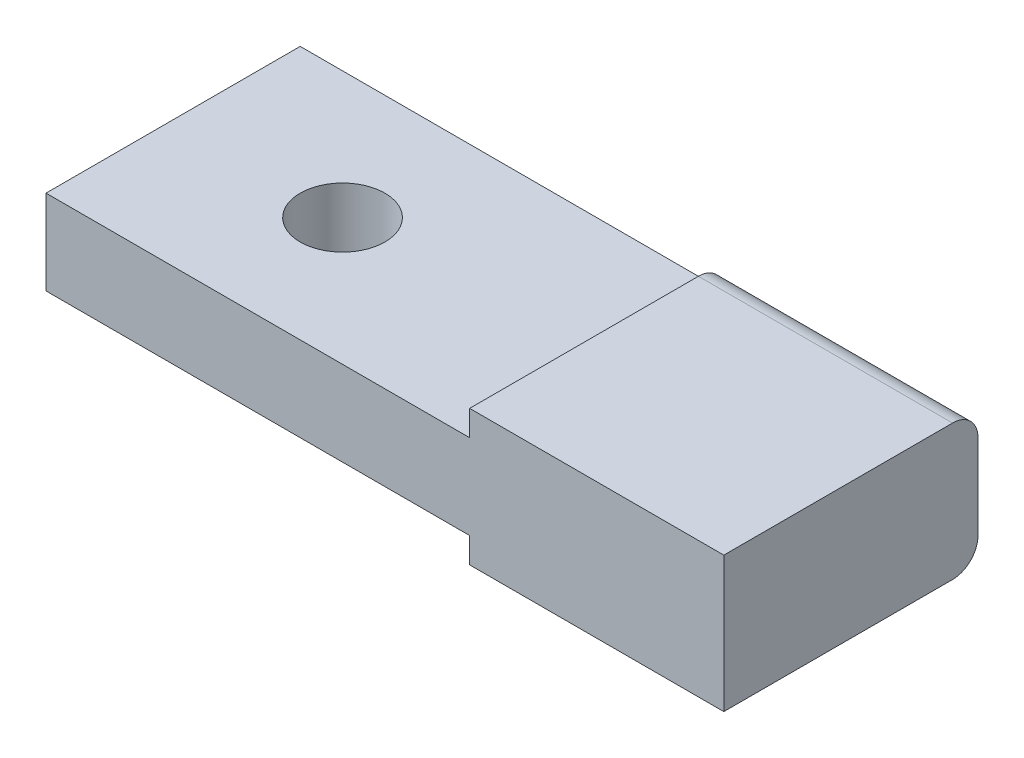
ISO-10303-21;
HEADER;
FILE_DESCRIPTION(('STEP AP214'),'2;1');
FILE_NAME('part.step','',(''),(''),'','','');
FILE_SCHEMA(('AUTOMOTIVE_DESIGN { 1 0 10303 214 1 1 1 1 }'));
ENDSEC;
DATA;
#1=APPLICATION_CONTEXT('core data for automotive mechanical design processes');
#2=APPLICATION_PROTOCOL_DEFINITION('international standard','automotive_design',2000,#1);
#3=PRODUCT_CONTEXT('',#1,'mechanical');
#4=PRODUCT('Part','Part','',(#3));
#5=PRODUCT_RELATED_PRODUCT_CATEGORY('part','',(#4));
#6=PRODUCT_DEFINITION_FORMATION('','',#4);
#7=PRODUCT_DEFINITION_CONTEXT('part definition',#1,'design');
#8=PRODUCT_DEFINITION('design','',#6,#7);
#9=PRODUCT_DEFINITION_SHAPE('','',#8);
#10=(LENGTH_UNIT() NAMED_UNIT(*) SI_UNIT(.MILLI.,.METRE.));
#11=(NAMED_UNIT(*) PLANE_ANGLE_UNIT() SI_UNIT($,.RADIAN.));
#12=(NAMED_UNIT(*) SI_UNIT($,.STERADIAN.) SOLID_ANGLE_UNIT());
#13=UNCERTAINTY_MEASURE_WITH_UNIT(LENGTH_MEASURE(1.E-05),#10,'distance_accuracy_value','');
#14=(GEOMETRIC_REPRESENTATION_CONTEXT(3) GLOBAL_UNCERTAINTY_ASSIGNED_CONTEXT((#13)) GLOBAL_UNIT_ASSIGNED_CONTEXT((#10,
#11,#12)) REPRESENTATION_CONTEXT('',''));
#15=CARTESIAN_POINT('',(0.,0.,0.));
#16=DIRECTION('',(0.,0.,1.));
#17=DIRECTION('',(1.,0.,0.));
#18=AXIS2_PLACEMENT_3D('',#15,#16,#17);
#19=CARTESIAN_POINT('',(0.,0.,15.));
#20=DIRECTION('',(1.,0.,0.));
#21=DIRECTION('',(0.,1.,0.));
#22=AXIS2_PLACEMENT_3D('',#19,#20,#21);
#23=PLANE('',#22);
#24=DIRECTION('',(0.,-1.,0.));
#25=VECTOR('',#24,1.);
#26=CARTESIAN_POINT('',(0.,0.,0.));
#27=LINE('',#26,#25);
#28=CARTESIAN_POINT('',(0.,6.5,0.));
#29=VERTEX_POINT('',#28);
#30=CARTESIAN_POINT('',(0.,1.5,0.));
#31=VERTEX_POINT('',#30);
#32=EDGE_CURVE('E144',#29,#31,#27,.T.);
#33=ORIENTED_EDGE('',*,*,#32,.T.);
#34=DIRECTION('',(0.,0.,1.));
#35=VECTOR('',#34,1.);
#36=CARTESIAN_POINT('',(0.,1.5,15.));
#37=LINE('',#36,#35);
#38=CARTESIAN_POINT('',(0.,1.5,15.));
#39=VERTEX_POINT('',#38);
#40=EDGE_CURVE('E129',#31,#39,#37,.T.);
#41=ORIENTED_EDGE('',*,*,#40,.T.);
#42=DIRECTION('',(0.,-1.,0.));
#43=VECTOR('',#42,1.);
#44=CARTESIAN_POINT('',(0.,0.,15.));
#45=LINE('',#44,#43);
#46=CARTESIAN_POINT('',(0.,6.5,15.));
#47=VERTEX_POINT('',#46);
#48=EDGE_CURVE('E124',#47,#39,#45,.T.);
#49=ORIENTED_EDGE('',*,*,#48,.F.);
#50=DIRECTION('',(0.,0.,-1.));
#51=VECTOR('',#50,1.);
#52=CARTESIAN_POINT('',(0.,6.5,15.));
#53=LINE('',#52,#51);
#54=EDGE_CURVE('E139',#47,#29,#53,.T.);
#55=ORIENTED_EDGE('',*,*,#54,.T.);
#56=EDGE_LOOP('',(#33,#41,#49,#55));
#57=FACE_BOUND('',#56,.T.);
#58=ADVANCED_FACE('F33',(#57),#23,.F.);
#59=CARTESIAN_POINT('',(0.,0.,15.));
#60=DIRECTION('',(0.,1.,0.));
#61=DIRECTION('',(0.,0.,1.));
#62=AXIS2_PLACEMENT_3D('',#59,#60,#61);
#63=PLANE('',#62);
#64=DIRECTION('',(0.,0.,-1.));
#65=VECTOR('',#64,1.);
#66=CARTESIAN_POINT('',(25.,0.,15.));
#67=LINE('',#66,#65);
#68=CARTESIAN_POINT('',(25.,0.,15.));
#69=VERTEX_POINT('',#68);
#70=CARTESIAN_POINT('',(25.,0.,1.5));
#71=VERTEX_POINT('',#70);
#72=EDGE_CURVE('E106',#69,#71,#67,.T.);
#73=ORIENTED_EDGE('',*,*,#72,.T.);
#74=DIRECTION('',(1.,0.,0.));
#75=VECTOR('',#74,1.);
#76=CARTESIAN_POINT('',(40.,0.,1.5));
#77=LINE('',#76,#75);
#78=CARTESIAN_POINT('',(40.,0.,1.5));
#79=VERTEX_POINT('',#78);
#80=EDGE_CURVE('E41',#71,#79,#77,.T.);
#81=ORIENTED_EDGE('',*,*,#80,.T.);
#82=DIRECTION('',(0.,0.,-1.));
#83=VECTOR('',#82,1.);
#84=CARTESIAN_POINT('',(40.,0.,15.));
#85=LINE('',#84,#83);
#86=CARTESIAN_POINT('',(40.,0.,15.));
#87=VERTEX_POINT('',#86);
#88=EDGE_CURVE('E161',#87,#79,#85,.T.);
#89=ORIENTED_EDGE('',*,*,#88,.F.);
#90=DIRECTION('',(1.,0.,0.));
#91=VECTOR('',#90,1.);
#92=CARTESIAN_POINT('',(0.,0.,15.));
#93=LINE('',#92,#91);
#94=EDGE_CURVE('E146',#69,#87,#93,.T.);
#95=ORIENTED_EDGE('',*,*,#94,.F.);
#96=EDGE_LOOP('',(#73,#81,#89,#95));
#97=FACE_BOUND('',#96,.T.);
#98=ADVANCED_FACE('F182',(#97),#63,.F.);
#99=CARTESIAN_POINT('',(40.,0.,15.));
#100=DIRECTION('',(-1.,0.,0.));
#101=DIRECTION('',(0.,0.,1.));
#102=AXIS2_PLACEMENT_3D('',#99,#100,#101);
#103=PLANE('',#102);
#104=DIRECTION('',(0.,1.,0.));
#105=VECTOR('',#104,1.);
#106=CARTESIAN_POINT('',(40.,0.,0.));
#107=LINE('',#106,#105);
#108=CARTESIAN_POINT('',(40.,1.5,0.));
#109=VERTEX_POINT('',#108);
#110=CARTESIAN_POINT('',(40.,6.5,0.));
#111=VERTEX_POINT('',#110);
#112=EDGE_CURVE('E147',#109,#111,#107,.T.);
#113=ORIENTED_EDGE('',*,*,#112,.T.);
#114=CARTESIAN_POINT('',(40.,6.5,1.5));
#115=DIRECTION('',(-1.,0.,0.));
#116=DIRECTION('',(0.,0.,1.));
#117=AXIS2_PLACEMENT_3D('',#114,#115,#116);
#118=CIRCLE('',#117,1.5);
#119=CARTESIAN_POINT('',(40.,8.,1.5));
#120=VERTEX_POINT('',#119);
#121=EDGE_CURVE('E179',#111,#120,#118,.F.);
#122=ORIENTED_EDGE('',*,*,#121,.T.);
#123=DIRECTION('',(0.,0.,-1.));
#124=VECTOR('',#123,1.);
#125=CARTESIAN_POINT('',(40.,8.,15.));
#126=LINE('',#125,#124);
#127=CARTESIAN_POINT('',(40.,8.,15.));
#128=VERTEX_POINT('',#127);
#129=EDGE_CURVE('E154',#128,#120,#126,.T.);
#130=ORIENTED_EDGE('',*,*,#129,.F.);
#131=DIRECTION('',(0.,1.,0.));
#132=VECTOR('',#131,1.);
#133=CARTESIAN_POINT('',(40.,0.,15.));
#134=LINE('',#133,#132);
#135=EDGE_CURVE('E149',#87,#128,#134,.T.);
#136=ORIENTED_EDGE('',*,*,#135,.F.);
#137=ORIENTED_EDGE('',*,*,#88,.T.);
#138=CARTESIAN_POINT('',(40.,1.5,1.5));
#139=DIRECTION('',(-1.,0.,0.));
#140=DIRECTION('',(0.,0.,1.));
#141=AXIS2_PLACEMENT_3D('',#138,#139,#140);
#142=CIRCLE('',#141,1.5);
#143=EDGE_CURVE('E54',#79,#109,#142,.F.);
#144=ORIENTED_EDGE('',*,*,#143,.T.);
#145=EDGE_LOOP('',(#113,#122,#130,#136,#137,#144));
#146=FACE_BOUND('',#145,.T.);
#147=ADVANCED_FACE('F185',(#146),#103,.F.);
#148=CARTESIAN_POINT('',(0.,8.,15.));
#149=DIRECTION('',(0.,-1.,0.));
#150=DIRECTION('',(0.,0.,-1.));
#151=AXIS2_PLACEMENT_3D('',#148,#149,#150);
#152=PLANE('',#151);
#153=ORIENTED_EDGE('',*,*,#129,.T.);
#154=DIRECTION('',(-1.,0.,0.));
#155=VECTOR('',#154,1.);
#156=CARTESIAN_POINT('',(25.,8.,1.5));
#157=LINE('',#156,#155);
#158=CARTESIAN_POINT('',(25.,8.,1.5));
#159=VERTEX_POINT('',#158);
#160=EDGE_CURVE('E166',#120,#159,#157,.T.);
#161=ORIENTED_EDGE('',*,*,#160,.T.);
#162=DIRECTION('',(0.,0.,1.));
#163=VECTOR('',#162,1.);
#164=CARTESIAN_POINT('',(25.,8.,15.));
#165=LINE('',#164,#163);
#166=CARTESIAN_POINT('',(25.,8.,15.));
#167=VERTEX_POINT('',#166);
#168=EDGE_CURVE('E142',#159,#167,#165,.T.);
#169=ORIENTED_EDGE('',*,*,#168,.T.);
#170=DIRECTION('',(-1.,0.,0.));
#171=VECTOR('',#170,1.);
#172=CARTESIAN_POINT('',(0.,8.,15.));
#173=LINE('',#172,#171);
#174=EDGE_CURVE('E151',#128,#167,#173,.T.);
#175=ORIENTED_EDGE('',*,*,#174,.F.);
#176=EDGE_LOOP('',(#153,#161,#169,#175));
#177=FACE_BOUND('',#176,.T.);
#178=ADVANCED_FACE('F191',(#177),#152,.F.);
#179=CARTESIAN_POINT('',(0.,0.,15.));
#180=DIRECTION('',(0.,0.,-1.));
#181=DIRECTION('',(-1.,0.,0.));
#182=AXIS2_PLACEMENT_3D('',#179,#180,#181);
#183=PLANE('',#182);
#184=ORIENTED_EDGE('',*,*,#48,.T.);
#185=DIRECTION('',(-1.,0.,0.));
#186=VECTOR('',#185,1.);
#187=CARTESIAN_POINT('',(-5.58948834541805,1.5,15.));
#188=LINE('',#187,#186);
#189=CARTESIAN_POINT('',(25.,1.5,15.));
#190=VERTEX_POINT('',#189);
#191=EDGE_CURVE('E110',#190,#39,#188,.T.);
#192=ORIENTED_EDGE('',*,*,#191,.F.);
#193=DIRECTION('',(0.,1.,0.));
#194=VECTOR('',#193,1.);
#195=CARTESIAN_POINT('',(25.,1.5,15.));
#196=LINE('',#195,#194);
#197=EDGE_CURVE('E102',#69,#190,#196,.T.);
#198=ORIENTED_EDGE('',*,*,#197,.F.);
#199=ORIENTED_EDGE('',*,*,#94,.T.);
#200=ORIENTED_EDGE('',*,*,#135,.T.);
#201=ORIENTED_EDGE('',*,*,#174,.T.);
#202=DIRECTION('',(0.,1.,0.));
#203=VECTOR('',#202,1.);
#204=CARTESIAN_POINT('',(25.,18.4171601715838,15.));
#205=LINE('',#204,#203);
#206=CARTESIAN_POINT('',(25.,6.5,15.));
#207=VERTEX_POINT('',#206);
#208=EDGE_CURVE('E133',#207,#167,#205,.T.);
#209=ORIENTED_EDGE('',*,*,#208,.F.);
#210=DIRECTION('',(1.,0.,0.));
#211=VECTOR('',#210,1.);
#212=CARTESIAN_POINT('',(-4.03459798568562,6.5,15.));
#213=LINE('',#212,#211);
#214=EDGE_CURVE('E131',#47,#207,#213,.T.);
#215=ORIENTED_EDGE('',*,*,#214,.F.);
#216=EDGE_LOOP('',(#184,#192,#198,#199,#200,#201,#209,#215));
#217=FACE_BOUND('',#216,.T.);
#218=ADVANCED_FACE('F121',(#217),#183,.F.);
#219=CARTESIAN_POINT('',(0.,0.,0.));
#220=DIRECTION('',(0.,0.,-1.));
#221=DIRECTION('',(-1.,0.,0.));
#222=AXIS2_PLACEMENT_3D('',#219,#220,#221);
#223=PLANE('',#222);
#224=DIRECTION('',(-1.,0.,0.));
#225=VECTOR('',#224,1.);
#226=CARTESIAN_POINT('',(0.,6.5,0.));
#227=LINE('',#226,#225);
#228=CARTESIAN_POINT('',(25.,6.5,0.));
#229=VERTEX_POINT('',#228);
#230=EDGE_CURVE('E164',#229,#29,#227,.T.);
#231=ORIENTED_EDGE('',*,*,#230,.F.);
#232=DIRECTION('',(-1.,0.,0.));
#233=VECTOR('',#232,1.);
#234=CARTESIAN_POINT('',(40.,6.5,0.));
#235=LINE('',#234,#233);
#236=EDGE_CURVE('E176',#229,#111,#235,.F.);
#237=ORIENTED_EDGE('',*,*,#236,.T.);
#238=ORIENTED_EDGE('',*,*,#112,.F.);
#239=DIRECTION('',(1.,0.,0.));
#240=VECTOR('',#239,1.);
#241=CARTESIAN_POINT('',(25.,1.5,0.));
#242=LINE('',#241,#240);
#243=CARTESIAN_POINT('',(25.,1.5,0.));
#244=VERTEX_POINT('',#243);
#245=EDGE_CURVE('E174',#109,#244,#242,.F.);
#246=ORIENTED_EDGE('',*,*,#245,.T.);
#247=DIRECTION('',(-1.,0.,0.));
#248=VECTOR('',#247,1.);
#249=CARTESIAN_POINT('',(-5.58948834541805,1.5,0.));
#250=LINE('',#249,#248);
#251=EDGE_CURVE('E118',#244,#31,#250,.T.);
#252=ORIENTED_EDGE('',*,*,#251,.T.);
#253=ORIENTED_EDGE('',*,*,#32,.F.);
#254=EDGE_LOOP('',(#231,#237,#238,#246,#252,#253));
#255=FACE_BOUND('',#254,.T.);
#256=ADVANCED_FACE('F203',(#255),#223,.T.);
#257=CARTESIAN_POINT('',(25.,18.4171601715838,0.));
#258=DIRECTION('',(1.,0.,0.));
#259=DIRECTION('',(0.,0.,-1.));
#260=AXIS2_PLACEMENT_3D('',#257,#258,#259);
#261=PLANE('',#260);
#262=ORIENTED_EDGE('',*,*,#168,.F.);
#263=CARTESIAN_POINT('',(25.,6.5,1.5));
#264=DIRECTION('',(1.,0.,0.));
#265=DIRECTION('',(0.,0.,-1.));
#266=AXIS2_PLACEMENT_3D('',#263,#264,#265);
#267=CIRCLE('',#266,1.5);
#268=EDGE_CURVE('E172',#159,#229,#267,.F.);
#269=ORIENTED_EDGE('',*,*,#268,.T.);
#270=DIRECTION('',(0.,0.,1.));
#271=VECTOR('',#270,1.);
#272=CARTESIAN_POINT('',(25.,6.5,0.));
#273=LINE('',#272,#271);
#274=EDGE_CURVE('E136',#229,#207,#273,.T.);
#275=ORIENTED_EDGE('',*,*,#274,.T.);
#276=ORIENTED_EDGE('',*,*,#208,.T.);
#277=EDGE_LOOP('',(#262,#269,#275,#276));
#278=FACE_BOUND('',#277,.T.);
#279=ADVANCED_FACE('F195',(#278),#261,.F.);
#280=CARTESIAN_POINT('',(-4.03459798568562,6.5,0.));
#281=DIRECTION('',(0.,-1.,0.));
#282=DIRECTION('',(0.,0.,-1.));
#283=AXIS2_PLACEMENT_3D('',#280,#281,#282);
#284=PLANE('',#283);
#285=CARTESIAN_POINT('',(10.,6.5,7.5));
#286=DIRECTION('',(0.,1.,0.));
#287=DIRECTION('',(0.,0.,1.));
#288=AXIS2_PLACEMENT_3D('',#285,#286,#287);
#289=CIRCLE('',#288,2.5);
#290=CARTESIAN_POINT('',(10.,6.5,10.));
#291=VERTEX_POINT('',#290);
#292=EDGE_CURVE('E169',#291,#291,#289,.T.);
#293=ORIENTED_EDGE('',*,*,#292,.F.);
#294=EDGE_LOOP('',(#293));
#295=FACE_BOUND('',#294,.T.);
#296=ORIENTED_EDGE('',*,*,#214,.T.);
#297=ORIENTED_EDGE('',*,*,#274,.F.);
#298=ORIENTED_EDGE('',*,*,#230,.T.);
#299=ORIENTED_EDGE('',*,*,#54,.F.);
#300=EDGE_LOOP('',(#296,#297,#298,#299));
#301=FACE_BOUND('',#300,.T.);
#302=ADVANCED_FACE('F199',(#295,#301),#284,.F.);
#303=CARTESIAN_POINT('',(-5.58948834541805,1.5,0.));
#304=DIRECTION('',(0.,1.,0.));
#305=DIRECTION('',(0.,0.,1.));
#306=AXIS2_PLACEMENT_3D('',#303,#304,#305);
#307=PLANE('',#306);
#308=CARTESIAN_POINT('',(10.,1.5,7.5));
#309=DIRECTION('',(0.,1.,0.));
#310=DIRECTION('',(0.,0.,1.));
#311=AXIS2_PLACEMENT_3D('',#308,#309,#310);
#312=CIRCLE('',#311,2.5);
#313=CARTESIAN_POINT('',(10.,1.5,10.));
#314=VERTEX_POINT('',#313);
#315=EDGE_CURVE('E111',#314,#314,#312,.T.);
#316=ORIENTED_EDGE('',*,*,#315,.T.);
#317=EDGE_LOOP('',(#316));
#318=FACE_BOUND('',#317,.T.);
#319=ORIENTED_EDGE('',*,*,#251,.F.);
#320=DIRECTION('',(0.,0.,1.));
#321=VECTOR('',#320,1.);
#322=CARTESIAN_POINT('',(25.,1.5,0.));
#323=LINE('',#322,#321);
#324=EDGE_CURVE('E105',#244,#190,#323,.T.);
#325=ORIENTED_EDGE('',*,*,#324,.T.);
#326=ORIENTED_EDGE('',*,*,#191,.T.);
#327=ORIENTED_EDGE('',*,*,#40,.F.);
#328=EDGE_LOOP('',(#319,#325,#326,#327));
#329=FACE_BOUND('',#328,.T.);
#330=ADVANCED_FACE('F115',(#318,#329),#307,.F.);
#331=CARTESIAN_POINT('',(25.,1.5,0.));
#332=DIRECTION('',(1.,0.,0.));
#333=DIRECTION('',(0.,0.,-1.));
#334=AXIS2_PLACEMENT_3D('',#331,#332,#333);
#335=PLANE('',#334);
#336=ORIENTED_EDGE('',*,*,#324,.F.);
#337=CARTESIAN_POINT('',(25.,1.5,1.5));
#338=DIRECTION('',(1.,0.,0.));
#339=DIRECTION('',(0.,0.,-1.));
#340=AXIS2_PLACEMENT_3D('',#337,#338,#339);
#341=CIRCLE('',#340,1.5);
#342=EDGE_CURVE('E11',#244,#71,#341,.F.);
#343=ORIENTED_EDGE('',*,*,#342,.T.);
#344=ORIENTED_EDGE('',*,*,#72,.F.);
#345=ORIENTED_EDGE('',*,*,#197,.T.);
#346=EDGE_LOOP('',(#336,#343,#344,#345));
#347=FACE_BOUND('',#346,.T.);
#348=ADVANCED_FACE('F104',(#347),#335,.F.);
#349=CARTESIAN_POINT('',(10.,-8.5,7.5));
#350=DIRECTION('',(0.,1.,0.));
#351=DIRECTION('',(0.,0.,1.));
#352=AXIS2_PLACEMENT_3D('',#349,#350,#351);
#353=CYLINDRICAL_SURFACE('',#352,2.5);
#354=ORIENTED_EDGE('',*,*,#292,.T.);
#355=EDGE_LOOP('',(#354));
#356=FACE_BOUND('',#355,.T.);
#357=ORIENTED_EDGE('',*,*,#315,.F.);
#358=EDGE_LOOP('',(#357));
#359=FACE_BOUND('',#358,.T.);
#360=ADVANCED_FACE('F211',(#356,#359),#353,.F.);
#361=CARTESIAN_POINT('',(0.,6.5,1.5));
#362=DIRECTION('',(1.,0.,0.));
#363=DIRECTION('',(0.,0.,-1.));
#364=AXIS2_PLACEMENT_3D('',#361,#362,#363);
#365=CYLINDRICAL_SURFACE('',#364,1.5);
#366=ORIENTED_EDGE('',*,*,#121,.F.);
#367=ORIENTED_EDGE('',*,*,#236,.F.);
#368=ORIENTED_EDGE('',*,*,#268,.F.);
#369=ORIENTED_EDGE('',*,*,#160,.F.);
#370=EDGE_LOOP('',(#366,#367,#368,#369));
#371=FACE_BOUND('',#370,.T.);
#372=ADVANCED_FACE('F206',(#371),#365,.T.);
#373=CARTESIAN_POINT('',(0.,1.5,1.5));
#374=DIRECTION('',(-1.,0.,0.));
#375=DIRECTION('',(0.,0.,1.));
#376=AXIS2_PLACEMENT_3D('',#373,#374,#375);
#377=CYLINDRICAL_SURFACE('',#376,1.5);
#378=ORIENTED_EDGE('',*,*,#342,.F.);
#379=ORIENTED_EDGE('',*,*,#245,.F.);
#380=ORIENTED_EDGE('',*,*,#143,.F.);
#381=ORIENTED_EDGE('',*,*,#80,.F.);
#382=EDGE_LOOP('',(#378,#379,#380,#381));
#383=FACE_BOUND('',#382,.T.);
#384=ADVANCED_FACE('F35',(#383),#377,.T.);
#385=CLOSED_SHELL('',(#58,#98,#147,#178,#218,#256,#279,#302,#330,#348,#360,#372,#384));
#386=MANIFOLD_SOLID_BREP('B2',#385);
#387=ADVANCED_BREP_SHAPE_REPRESENTATION('',(#18,#386),#14);
#388=SHAPE_DEFINITION_REPRESENTATION(#9,#387);
ENDSEC;
END-ISO-10303-21;
